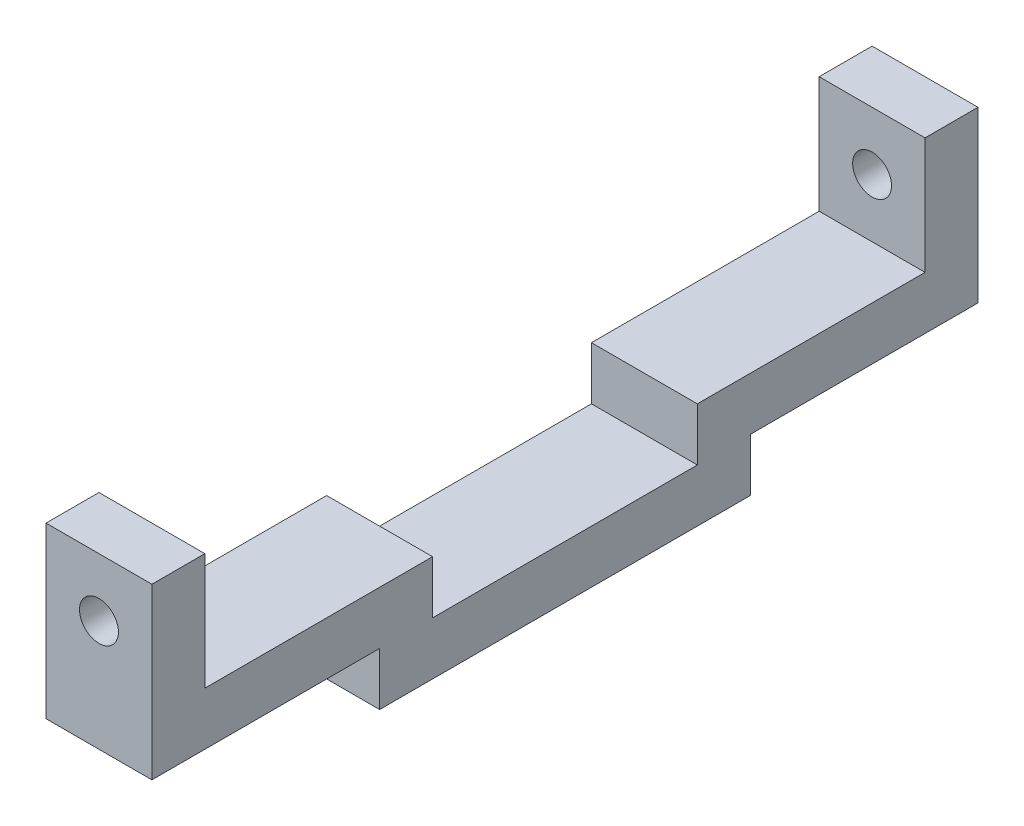
ISO-10303-21;
HEADER;
FILE_DESCRIPTION(('STEP AP214'),'2;1');
FILE_NAME('part.step','',(''),(''),'','','');
FILE_SCHEMA(('AUTOMOTIVE_DESIGN { 1 0 10303 214 1 1 1 1 }'));
ENDSEC;
DATA;
#1=APPLICATION_CONTEXT('core data for automotive mechanical design processes');
#2=APPLICATION_PROTOCOL_DEFINITION('international standard','automotive_design',2000,#1);
#3=PRODUCT_CONTEXT('',#1,'mechanical');
#4=PRODUCT('Part','Part','',(#3));
#5=PRODUCT_RELATED_PRODUCT_CATEGORY('part','',(#4));
#6=PRODUCT_DEFINITION_FORMATION('','',#4);
#7=PRODUCT_DEFINITION_CONTEXT('part definition',#1,'design');
#8=PRODUCT_DEFINITION('design','',#6,#7);
#9=PRODUCT_DEFINITION_SHAPE('','',#8);
#10=(LENGTH_UNIT() NAMED_UNIT(*) SI_UNIT(.MILLI.,.METRE.));
#11=(NAMED_UNIT(*) PLANE_ANGLE_UNIT() SI_UNIT($,.RADIAN.));
#12=(NAMED_UNIT(*) SI_UNIT($,.STERADIAN.) SOLID_ANGLE_UNIT());
#13=UNCERTAINTY_MEASURE_WITH_UNIT(LENGTH_MEASURE(1.E-05),#10,'distance_accuracy_value','');
#14=(GEOMETRIC_REPRESENTATION_CONTEXT(3) GLOBAL_UNCERTAINTY_ASSIGNED_CONTEXT((#13)) GLOBAL_UNIT_ASSIGNED_CONTEXT((#10,
#11,#12)) REPRESENTATION_CONTEXT('',''));
#15=CARTESIAN_POINT('',(0.,0.,0.));
#16=DIRECTION('',(0.,0.,1.));
#17=DIRECTION('',(1.,0.,0.));
#18=AXIS2_PLACEMENT_3D('',#15,#16,#17);
#19=CARTESIAN_POINT('',(10.,-10.5,0.));
#20=DIRECTION('',(0.,1.,0.));
#21=DIRECTION('',(0.,0.,1.));
#22=AXIS2_PLACEMENT_3D('',#19,#20,#21);
#23=PLANE('',#22);
#24=DIRECTION('',(1.,0.,0.));
#25=VECTOR('',#24,1.);
#26=CARTESIAN_POINT('',(0.,-10.5,-17.5));
#27=LINE('',#26,#25);
#28=CARTESIAN_POINT('',(0.,-10.5,-17.5));
#29=VERTEX_POINT('',#28);
#30=CARTESIAN_POINT('',(10.,-10.5,-17.5));
#31=VERTEX_POINT('',#30);
#32=EDGE_CURVE('E357',#29,#31,#27,.T.);
#33=ORIENTED_EDGE('',*,*,#32,.T.);
#34=DIRECTION('',(0.,0.,-1.));
#35=VECTOR('',#34,1.);
#36=CARTESIAN_POINT('',(10.,-10.5,0.));
#37=LINE('',#36,#35);
#38=CARTESIAN_POINT('',(10.,-10.5,17.5));
#39=VERTEX_POINT('',#38);
#40=EDGE_CURVE('E323',#39,#31,#37,.T.);
#41=ORIENTED_EDGE('',*,*,#40,.F.);
#42=DIRECTION('',(1.,0.,0.));
#43=VECTOR('',#42,1.);
#44=CARTESIAN_POINT('',(0.,-10.5,17.5));
#45=LINE('',#44,#43);
#46=CARTESIAN_POINT('',(0.,-10.5,17.5));
#47=VERTEX_POINT('',#46);
#48=EDGE_CURVE('E132',#47,#39,#45,.T.);
#49=ORIENTED_EDGE('',*,*,#48,.F.);
#50=DIRECTION('',(0.,0.,-1.));
#51=VECTOR('',#50,1.);
#52=CARTESIAN_POINT('',(0.,-10.5,0.));
#53=LINE('',#52,#51);
#54=EDGE_CURVE('E245',#47,#29,#53,.T.);
#55=ORIENTED_EDGE('',*,*,#54,.T.);
#56=EDGE_LOOP('',(#33,#41,#49,#55));
#57=FACE_BOUND('',#56,.T.);
#58=ADVANCED_FACE('F107',(#57),#23,.F.);
#59=CARTESIAN_POINT('',(10.,0.,-39.));
#60=DIRECTION('',(0.,0.,1.));
#61=DIRECTION('',(0.,-1.,0.));
#62=AXIS2_PLACEMENT_3D('',#59,#60,#61);
#63=PLANE('',#62);
#64=CARTESIAN_POINT('',(5.,5.,-39.));
#65=DIRECTION('',(0.,0.,1.));
#66=DIRECTION('',(1.,0.,0.));
#67=AXIS2_PLACEMENT_3D('',#64,#65,#66);
#68=CIRCLE('',#67,1.83658591452709);
#69=CARTESIAN_POINT('',(6.83658591452709,5.,-39.));
#70=VERTEX_POINT('',#69);
#71=EDGE_CURVE('E339',#70,#70,#68,.T.);
#72=ORIENTED_EDGE('',*,*,#71,.T.);
#73=EDGE_LOOP('',(#72));
#74=FACE_BOUND('',#73,.T.);
#75=DIRECTION('',(1.,0.,0.));
#76=VECTOR('',#75,1.);
#77=CARTESIAN_POINT('',(0.,-5.5,-39.));
#78=LINE('',#77,#76);
#79=CARTESIAN_POINT('',(0.,-5.5,-39.));
#80=VERTEX_POINT('',#79);
#81=CARTESIAN_POINT('',(10.,-5.5,-39.));
#82=VERTEX_POINT('',#81);
#83=EDGE_CURVE('E124',#80,#82,#78,.T.);
#84=ORIENTED_EDGE('',*,*,#83,.F.);
#85=DIRECTION('',(0.,1.,0.));
#86=VECTOR('',#85,1.);
#87=CARTESIAN_POINT('',(0.,0.,-39.));
#88=LINE('',#87,#86);
#89=CARTESIAN_POINT('',(0.,10.5,-39.));
#90=VERTEX_POINT('',#89);
#91=EDGE_CURVE('E235',#80,#90,#88,.T.);
#92=ORIENTED_EDGE('',*,*,#91,.T.);
#93=DIRECTION('',(-1.,0.,0.));
#94=VECTOR('',#93,1.);
#95=CARTESIAN_POINT('',(10.,10.5,-39.));
#96=LINE('',#95,#94);
#97=CARTESIAN_POINT('',(10.,10.5,-39.));
#98=VERTEX_POINT('',#97);
#99=EDGE_CURVE('E256',#98,#90,#96,.T.);
#100=ORIENTED_EDGE('',*,*,#99,.F.);
#101=DIRECTION('',(0.,1.,0.));
#102=VECTOR('',#101,1.);
#103=CARTESIAN_POINT('',(10.,0.,-39.));
#104=LINE('',#103,#102);
#105=EDGE_CURVE('E237',#82,#98,#104,.T.);
#106=ORIENTED_EDGE('',*,*,#105,.F.);
#107=EDGE_LOOP('',(#84,#92,#100,#106));
#108=FACE_BOUND('',#107,.T.);
#109=ADVANCED_FACE('F233',(#74,#108),#63,.F.);
#110=CARTESIAN_POINT('',(0.,0.,0.));
#111=DIRECTION('',(1.,0.,0.));
#112=DIRECTION('',(0.,0.,-1.));
#113=AXIS2_PLACEMENT_3D('',#110,#111,#112);
#114=PLANE('',#113);
#115=DIRECTION('',(0.,1.,0.));
#116=VECTOR('',#115,1.);
#117=CARTESIAN_POINT('',(0.,-10.5,-17.5));
#118=LINE('',#117,#116);
#119=CARTESIAN_POINT('',(0.,-5.5,-17.5));
#120=VERTEX_POINT('',#119);
#121=EDGE_CURVE('E228',#29,#120,#118,.T.);
#122=ORIENTED_EDGE('',*,*,#121,.F.);
#123=ORIENTED_EDGE('',*,*,#54,.F.);
#124=DIRECTION('',(0.,1.,0.));
#125=VECTOR('',#124,1.);
#126=CARTESIAN_POINT('',(0.,-10.5,17.5));
#127=LINE('',#126,#125);
#128=CARTESIAN_POINT('',(0.,-5.5,17.5));
#129=VERTEX_POINT('',#128);
#130=EDGE_CURVE('E354',#47,#129,#127,.T.);
#131=ORIENTED_EDGE('',*,*,#130,.T.);
#132=DIRECTION('',(0.,0.,1.));
#133=VECTOR('',#132,1.);
#134=CARTESIAN_POINT('',(0.,-5.5,39.));
#135=LINE('',#134,#133);
#136=CARTESIAN_POINT('',(0.,-5.5,39.));
#137=VERTEX_POINT('',#136);
#138=EDGE_CURVE('E348',#129,#137,#135,.T.);
#139=ORIENTED_EDGE('',*,*,#138,.T.);
#140=DIRECTION('',(0.,1.,0.));
#141=VECTOR('',#140,1.);
#142=CARTESIAN_POINT('',(0.,0.,39.));
#143=LINE('',#142,#141);
#144=CARTESIAN_POINT('',(0.,10.5,39.));
#145=VERTEX_POINT('',#144);
#146=EDGE_CURVE('E252',#137,#145,#143,.T.);
#147=ORIENTED_EDGE('',*,*,#146,.T.);
#148=DIRECTION('',(0.,0.,-1.));
#149=VECTOR('',#148,1.);
#150=CARTESIAN_POINT('',(0.,10.5,0.));
#151=LINE('',#150,#149);
#152=CARTESIAN_POINT('',(0.,10.5,34.));
#153=VERTEX_POINT('',#152);
#154=EDGE_CURVE('E312',#145,#153,#151,.T.);
#155=ORIENTED_EDGE('',*,*,#154,.T.);
#156=DIRECTION('',(0.,-1.,0.));
#157=VECTOR('',#156,1.);
#158=CARTESIAN_POINT('',(0.,0.,34.));
#159=LINE('',#158,#157);
#160=CARTESIAN_POINT('',(0.,-0.500000000000004,34.));
#161=VERTEX_POINT('',#160);
#162=EDGE_CURVE('E308',#153,#161,#159,.T.);
#163=ORIENTED_EDGE('',*,*,#162,.T.);
#164=DIRECTION('',(0.,0.,-1.));
#165=VECTOR('',#164,1.);
#166=CARTESIAN_POINT('',(0.,-0.500000000000004,34.));
#167=LINE('',#166,#165);
#168=CARTESIAN_POINT('',(0.,-0.5,12.5));
#169=VERTEX_POINT('',#168);
#170=EDGE_CURVE('E275',#161,#169,#167,.T.);
#171=ORIENTED_EDGE('',*,*,#170,.T.);
#172=DIRECTION('',(0.,1.,0.));
#173=VECTOR('',#172,1.);
#174=CARTESIAN_POINT('',(0.,-5.5,12.5));
#175=LINE('',#174,#173);
#176=CARTESIAN_POINT('',(0.,-5.5,12.5));
#177=VERTEX_POINT('',#176);
#178=EDGE_CURVE('E272',#177,#169,#175,.T.);
#179=ORIENTED_EDGE('',*,*,#178,.F.);
#180=DIRECTION('',(0.,0.,-1.));
#181=VECTOR('',#180,1.);
#182=CARTESIAN_POINT('',(0.,-5.5,0.));
#183=LINE('',#182,#181);
#184=CARTESIAN_POINT('',(0.,-5.5,-12.5));
#185=VERTEX_POINT('',#184);
#186=EDGE_CURVE('E299',#177,#185,#183,.T.);
#187=ORIENTED_EDGE('',*,*,#186,.T.);
#188=DIRECTION('',(0.,1.,0.));
#189=VECTOR('',#188,1.);
#190=CARTESIAN_POINT('',(0.,-5.5,-12.5));
#191=LINE('',#190,#189);
#192=CARTESIAN_POINT('',(0.,-0.500000000000001,-12.5));
#193=VERTEX_POINT('',#192);
#194=EDGE_CURVE('E285',#185,#193,#191,.T.);
#195=ORIENTED_EDGE('',*,*,#194,.T.);
#196=DIRECTION('',(0.,0.,1.));
#197=VECTOR('',#196,1.);
#198=CARTESIAN_POINT('',(0.,-0.500000000000001,-34.));
#199=LINE('',#198,#197);
#200=CARTESIAN_POINT('',(0.,-0.500000000000001,-34.));
#201=VERTEX_POINT('',#200);
#202=EDGE_CURVE('E288',#201,#193,#199,.T.);
#203=ORIENTED_EDGE('',*,*,#202,.F.);
#204=DIRECTION('',(0.,-1.,0.));
#205=VECTOR('',#204,1.);
#206=CARTESIAN_POINT('',(0.,0.,-34.));
#207=LINE('',#206,#205);
#208=CARTESIAN_POINT('',(0.,10.5,-34.));
#209=VERTEX_POINT('',#208);
#210=EDGE_CURVE('E309',#209,#201,#207,.T.);
#211=ORIENTED_EDGE('',*,*,#210,.F.);
#212=EDGE_CURVE('E243',#209,#90,#151,.T.);
#213=ORIENTED_EDGE('',*,*,#212,.T.);
#214=ORIENTED_EDGE('',*,*,#91,.F.);
#215=DIRECTION('',(0.,0.,-1.));
#216=VECTOR('',#215,1.);
#217=CARTESIAN_POINT('',(0.,-5.5,-39.));
#218=LINE('',#217,#216);
#219=EDGE_CURVE('E222',#120,#80,#218,.T.);
#220=ORIENTED_EDGE('',*,*,#219,.F.);
#221=EDGE_LOOP('',(#122,#123,#131,#139,#147,#155,#163,#171,#179,#187,#195,#203,#211,#213,#214,#220));
#222=FACE_BOUND('',#221,.T.);
#223=ADVANCED_FACE('F240',(#222),#114,.F.);
#224=CARTESIAN_POINT('',(10.,0.,0.));
#225=DIRECTION('',(1.,0.,0.));
#226=DIRECTION('',(0.,0.,-1.));
#227=AXIS2_PLACEMENT_3D('',#224,#225,#226);
#228=PLANE('',#227);
#229=ORIENTED_EDGE('',*,*,#40,.T.);
#230=DIRECTION('',(0.,1.,0.));
#231=VECTOR('',#230,1.);
#232=CARTESIAN_POINT('',(10.,-10.5,-17.5));
#233=LINE('',#232,#231);
#234=CARTESIAN_POINT('',(10.,-5.5,-17.5));
#235=VERTEX_POINT('',#234);
#236=EDGE_CURVE('E229',#31,#235,#233,.T.);
#237=ORIENTED_EDGE('',*,*,#236,.T.);
#238=DIRECTION('',(0.,0.,-1.));
#239=VECTOR('',#238,1.);
#240=CARTESIAN_POINT('',(10.,-5.5,-39.));
#241=LINE('',#240,#239);
#242=EDGE_CURVE('E366',#235,#82,#241,.T.);
#243=ORIENTED_EDGE('',*,*,#242,.T.);
#244=ORIENTED_EDGE('',*,*,#105,.T.);
#245=DIRECTION('',(0.,0.,-1.));
#246=VECTOR('',#245,1.);
#247=CARTESIAN_POINT('',(10.,10.5,0.));
#248=LINE('',#247,#246);
#249=CARTESIAN_POINT('',(10.,10.5,-34.));
#250=VERTEX_POINT('',#249);
#251=EDGE_CURVE('E244',#250,#98,#248,.T.);
#252=ORIENTED_EDGE('',*,*,#251,.F.);
#253=DIRECTION('',(0.,-1.,0.));
#254=VECTOR('',#253,1.);
#255=CARTESIAN_POINT('',(10.,0.,-34.));
#256=LINE('',#255,#254);
#257=CARTESIAN_POINT('',(10.,-0.500000000000001,-34.));
#258=VERTEX_POINT('',#257);
#259=EDGE_CURVE('E248',#250,#258,#256,.T.);
#260=ORIENTED_EDGE('',*,*,#259,.T.);
#261=DIRECTION('',(0.,0.,1.));
#262=VECTOR('',#261,1.);
#263=CARTESIAN_POINT('',(10.,-0.500000000000001,-34.));
#264=LINE('',#263,#262);
#265=CARTESIAN_POINT('',(10.,-0.500000000000001,-12.5));
#266=VERTEX_POINT('',#265);
#267=EDGE_CURVE('E282',#258,#266,#264,.T.);
#268=ORIENTED_EDGE('',*,*,#267,.T.);
#269=DIRECTION('',(0.,1.,0.));
#270=VECTOR('',#269,1.);
#271=CARTESIAN_POINT('',(10.,-5.5,-12.5));
#272=LINE('',#271,#270);
#273=CARTESIAN_POINT('',(10.,-5.5,-12.5));
#274=VERTEX_POINT('',#273);
#275=EDGE_CURVE('E284',#274,#266,#272,.T.);
#276=ORIENTED_EDGE('',*,*,#275,.F.);
#277=DIRECTION('',(0.,0.,-1.));
#278=VECTOR('',#277,1.);
#279=CARTESIAN_POINT('',(10.,-5.5,0.));
#280=LINE('',#279,#278);
#281=CARTESIAN_POINT('',(10.,-5.5,12.5));
#282=VERTEX_POINT('',#281);
#283=EDGE_CURVE('E301',#282,#274,#280,.T.);
#284=ORIENTED_EDGE('',*,*,#283,.F.);
#285=DIRECTION('',(0.,1.,0.));
#286=VECTOR('',#285,1.);
#287=CARTESIAN_POINT('',(10.,-5.5,12.5));
#288=LINE('',#287,#286);
#289=CARTESIAN_POINT('',(10.,-0.5,12.5));
#290=VERTEX_POINT('',#289);
#291=EDGE_CURVE('E271',#282,#290,#288,.T.);
#292=ORIENTED_EDGE('',*,*,#291,.T.);
#293=DIRECTION('',(0.,0.,-1.));
#294=VECTOR('',#293,1.);
#295=CARTESIAN_POINT('',(10.,-0.500000000000004,34.));
#296=LINE('',#295,#294);
#297=CARTESIAN_POINT('',(10.,-0.500000000000004,34.));
#298=VERTEX_POINT('',#297);
#299=EDGE_CURVE('E268',#298,#290,#296,.T.);
#300=ORIENTED_EDGE('',*,*,#299,.F.);
#301=DIRECTION('',(0.,-1.,0.));
#302=VECTOR('',#301,1.);
#303=CARTESIAN_POINT('',(10.,0.,34.));
#304=LINE('',#303,#302);
#305=CARTESIAN_POINT('',(10.,10.5,34.));
#306=VERTEX_POINT('',#305);
#307=EDGE_CURVE('E328',#306,#298,#304,.T.);
#308=ORIENTED_EDGE('',*,*,#307,.F.);
#309=CARTESIAN_POINT('',(10.,10.5,39.));
#310=VERTEX_POINT('',#309);
#311=EDGE_CURVE('E250',#310,#306,#248,.T.);
#312=ORIENTED_EDGE('',*,*,#311,.F.);
#313=DIRECTION('',(0.,1.,0.));
#314=VECTOR('',#313,1.);
#315=CARTESIAN_POINT('',(10.,0.,39.));
#316=LINE('',#315,#314);
#317=CARTESIAN_POINT('',(10.,-5.5,39.));
#318=VERTEX_POINT('',#317);
#319=EDGE_CURVE('E326',#318,#310,#316,.T.);
#320=ORIENTED_EDGE('',*,*,#319,.F.);
#321=DIRECTION('',(0.,0.,1.));
#322=VECTOR('',#321,1.);
#323=CARTESIAN_POINT('',(10.,-5.5,39.));
#324=LINE('',#323,#322);
#325=CARTESIAN_POINT('',(10.,-5.5,17.5));
#326=VERTEX_POINT('',#325);
#327=EDGE_CURVE('E352',#326,#318,#324,.T.);
#328=ORIENTED_EDGE('',*,*,#327,.F.);
#329=DIRECTION('',(0.,1.,0.));
#330=VECTOR('',#329,1.);
#331=CARTESIAN_POINT('',(10.,-10.5,17.5));
#332=LINE('',#331,#330);
#333=EDGE_CURVE('E355',#39,#326,#332,.T.);
#334=ORIENTED_EDGE('',*,*,#333,.F.);
#335=EDGE_LOOP('',(#229,#237,#243,#244,#252,#260,#268,#276,#284,#292,#300,#308,#312,#320,#328,#334));
#336=FACE_BOUND('',#335,.T.);
#337=ADVANCED_FACE('F374',(#336),#228,.T.);
#338=CARTESIAN_POINT('',(10.,0.,-34.));
#339=DIRECTION('',(0.,0.,-1.));
#340=DIRECTION('',(-1.,0.,0.));
#341=AXIS2_PLACEMENT_3D('',#338,#339,#340);
#342=PLANE('',#341);
#343=CARTESIAN_POINT('',(5.,5.,-34.));
#344=DIRECTION('',(0.,0.,-1.));
#345=DIRECTION('',(-1.,0.,0.));
#346=AXIS2_PLACEMENT_3D('',#343,#344,#345);
#347=CIRCLE('',#346,1.83658591452709);
#348=CARTESIAN_POINT('',(3.16341408547291,5.,-34.));
#349=VERTEX_POINT('',#348);
#350=EDGE_CURVE('E291',#349,#349,#347,.T.);
#351=ORIENTED_EDGE('',*,*,#350,.T.);
#352=EDGE_LOOP('',(#351));
#353=FACE_BOUND('',#352,.T.);
#354=DIRECTION('',(-1.,0.,0.));
#355=VECTOR('',#354,1.);
#356=CARTESIAN_POINT('',(10.,-0.500000000000001,-34.));
#357=LINE('',#356,#355);
#358=EDGE_CURVE('E12',#258,#201,#357,.T.);
#359=ORIENTED_EDGE('',*,*,#358,.F.);
#360=ORIENTED_EDGE('',*,*,#259,.F.);
#361=DIRECTION('',(-1.,0.,0.));
#362=VECTOR('',#361,1.);
#363=CARTESIAN_POINT('',(10.,10.5,-34.));
#364=LINE('',#363,#362);
#365=EDGE_CURVE('E263',#250,#209,#364,.T.);
#366=ORIENTED_EDGE('',*,*,#365,.T.);
#367=ORIENTED_EDGE('',*,*,#210,.T.);
#368=EDGE_LOOP('',(#359,#360,#366,#367));
#369=FACE_BOUND('',#368,.T.);
#370=ADVANCED_FACE('F406',(#353,#369),#342,.F.);
#371=CARTESIAN_POINT('',(10.,-5.5,0.));
#372=DIRECTION('',(0.,1.,0.));
#373=DIRECTION('',(0.,0.,1.));
#374=AXIS2_PLACEMENT_3D('',#371,#372,#373);
#375=PLANE('',#374);
#376=ORIENTED_EDGE('',*,*,#186,.F.);
#377=DIRECTION('',(1.,0.,0.));
#378=VECTOR('',#377,1.);
#379=CARTESIAN_POINT('',(10.,-5.5,12.5));
#380=LINE('',#379,#378);
#381=EDGE_CURVE('E116',#177,#282,#380,.T.);
#382=ORIENTED_EDGE('',*,*,#381,.T.);
#383=ORIENTED_EDGE('',*,*,#283,.T.);
#384=DIRECTION('',(-1.,0.,0.));
#385=VECTOR('',#384,1.);
#386=CARTESIAN_POINT('',(10.,-5.5,-12.5));
#387=LINE('',#386,#385);
#388=EDGE_CURVE('E267',#274,#185,#387,.T.);
#389=ORIENTED_EDGE('',*,*,#388,.T.);
#390=EDGE_LOOP('',(#376,#382,#383,#389));
#391=FACE_BOUND('',#390,.T.);
#392=ADVANCED_FACE('F297',(#391),#375,.T.);
#393=CARTESIAN_POINT('',(10.,0.,34.));
#394=DIRECTION('',(0.,0.,-1.));
#395=DIRECTION('',(-1.,0.,0.));
#396=AXIS2_PLACEMENT_3D('',#393,#394,#395);
#397=PLANE('',#396);
#398=CARTESIAN_POINT('',(5.,5.,34.));
#399=DIRECTION('',(0.,0.,-1.));
#400=DIRECTION('',(-1.,0.,0.));
#401=AXIS2_PLACEMENT_3D('',#398,#399,#400);
#402=CIRCLE('',#401,1.83658591452709);
#403=CARTESIAN_POINT('',(3.16341408547291,5.,34.));
#404=VERTEX_POINT('',#403);
#405=EDGE_CURVE('E336',#404,#404,#402,.T.);
#406=ORIENTED_EDGE('',*,*,#405,.F.);
#407=EDGE_LOOP('',(#406));
#408=FACE_BOUND('',#407,.T.);
#409=ORIENTED_EDGE('',*,*,#307,.T.);
#410=DIRECTION('',(-1.,0.,0.));
#411=VECTOR('',#410,1.);
#412=CARTESIAN_POINT('',(10.,-0.500000000000004,34.));
#413=LINE('',#412,#411);
#414=EDGE_CURVE('E265',#298,#161,#413,.T.);
#415=ORIENTED_EDGE('',*,*,#414,.T.);
#416=ORIENTED_EDGE('',*,*,#162,.F.);
#417=DIRECTION('',(-1.,0.,0.));
#418=VECTOR('',#417,1.);
#419=CARTESIAN_POINT('',(10.,10.5,34.));
#420=LINE('',#419,#418);
#421=EDGE_CURVE('E261',#306,#153,#420,.T.);
#422=ORIENTED_EDGE('',*,*,#421,.F.);
#423=EDGE_LOOP('',(#409,#415,#416,#422));
#424=FACE_BOUND('',#423,.T.);
#425=ADVANCED_FACE('F392',(#408,#424),#397,.T.);
#426=CARTESIAN_POINT('',(10.,10.5,0.));
#427=DIRECTION('',(0.,1.,0.));
#428=DIRECTION('',(0.,0.,1.));
#429=AXIS2_PLACEMENT_3D('',#426,#427,#428);
#430=PLANE('',#429);
#431=ORIENTED_EDGE('',*,*,#154,.F.);
#432=DIRECTION('',(-1.,0.,0.));
#433=VECTOR('',#432,1.);
#434=CARTESIAN_POINT('',(10.,10.5,39.));
#435=LINE('',#434,#433);
#436=EDGE_CURVE('E258',#310,#145,#435,.T.);
#437=ORIENTED_EDGE('',*,*,#436,.F.);
#438=ORIENTED_EDGE('',*,*,#311,.T.);
#439=ORIENTED_EDGE('',*,*,#421,.T.);
#440=EDGE_LOOP('',(#431,#437,#438,#439));
#441=FACE_BOUND('',#440,.T.);
#442=ADVANCED_FACE('F388',(#441),#430,.T.);
#443=CARTESIAN_POINT('',(10.,0.,39.));
#444=DIRECTION('',(0.,0.,1.));
#445=DIRECTION('',(0.,-1.,0.));
#446=AXIS2_PLACEMENT_3D('',#443,#444,#445);
#447=PLANE('',#446);
#448=DIRECTION('',(1.,0.,0.));
#449=VECTOR('',#448,1.);
#450=CARTESIAN_POINT('',(0.,-5.5,39.));
#451=LINE('',#450,#449);
#452=EDGE_CURVE('E345',#137,#318,#451,.T.);
#453=ORIENTED_EDGE('',*,*,#452,.T.);
#454=ORIENTED_EDGE('',*,*,#319,.T.);
#455=ORIENTED_EDGE('',*,*,#436,.T.);
#456=ORIENTED_EDGE('',*,*,#146,.F.);
#457=EDGE_LOOP('',(#453,#454,#455,#456));
#458=FACE_BOUND('',#457,.T.);
#459=CARTESIAN_POINT('',(5.,5.,39.));
#460=DIRECTION('',(0.,0.,1.));
#461=DIRECTION('',(1.,0.,0.));
#462=AXIS2_PLACEMENT_3D('',#459,#460,#461);
#463=CIRCLE('',#462,1.83658591452709);
#464=CARTESIAN_POINT('',(6.83658591452709,5.,39.));
#465=VERTEX_POINT('',#464);
#466=EDGE_CURVE('E342',#465,#465,#463,.T.);
#467=ORIENTED_EDGE('',*,*,#466,.F.);
#468=EDGE_LOOP('',(#467));
#469=FACE_BOUND('',#468,.T.);
#470=ADVANCED_FACE('F382',(#458,#469),#447,.T.);
#471=ORIENTED_EDGE('',*,*,#212,.F.);
#472=ORIENTED_EDGE('',*,*,#365,.F.);
#473=ORIENTED_EDGE('',*,*,#251,.T.);
#474=ORIENTED_EDGE('',*,*,#99,.T.);
#475=EDGE_LOOP('',(#471,#472,#473,#474));
#476=FACE_BOUND('',#475,.T.);
#477=ADVANCED_FACE('F408',(#476),#430,.T.);
#478=CARTESIAN_POINT('',(10.,-5.5,-12.5));
#479=DIRECTION('',(0.,0.,1.));
#480=DIRECTION('',(1.,0.,0.));
#481=AXIS2_PLACEMENT_3D('',#478,#479,#480);
#482=PLANE('',#481);
#483=ORIENTED_EDGE('',*,*,#194,.F.);
#484=ORIENTED_EDGE('',*,*,#388,.F.);
#485=ORIENTED_EDGE('',*,*,#275,.T.);
#486=DIRECTION('',(-1.,0.,0.));
#487=VECTOR('',#486,1.);
#488=CARTESIAN_POINT('',(10.,-0.500000000000001,-12.5));
#489=LINE('',#488,#487);
#490=EDGE_CURVE('E111',#266,#193,#489,.T.);
#491=ORIENTED_EDGE('',*,*,#490,.T.);
#492=EDGE_LOOP('',(#483,#484,#485,#491));
#493=FACE_BOUND('',#492,.T.);
#494=ADVANCED_FACE('F304',(#493),#482,.T.);
#495=CARTESIAN_POINT('',(10.,-0.500000000000001,-34.));
#496=DIRECTION('',(0.,-1.,0.));
#497=DIRECTION('',(0.,0.,-1.));
#498=AXIS2_PLACEMENT_3D('',#495,#496,#497);
#499=PLANE('',#498);
#500=ORIENTED_EDGE('',*,*,#202,.T.);
#501=ORIENTED_EDGE('',*,*,#490,.F.);
#502=ORIENTED_EDGE('',*,*,#267,.F.);
#503=ORIENTED_EDGE('',*,*,#358,.T.);
#504=EDGE_LOOP('',(#500,#501,#502,#503));
#505=FACE_BOUND('',#504,.T.);
#506=ADVANCED_FACE('F109',(#505),#499,.F.);
#507=CARTESIAN_POINT('',(10.,-5.5,12.5));
#508=DIRECTION('',(0.,0.,1.));
#509=DIRECTION('',(1.,0.,0.));
#510=AXIS2_PLACEMENT_3D('',#507,#508,#509);
#511=PLANE('',#510);
#512=ORIENTED_EDGE('',*,*,#178,.T.);
#513=DIRECTION('',(-1.,0.,0.));
#514=VECTOR('',#513,1.);
#515=CARTESIAN_POINT('',(10.,-0.5,12.5));
#516=LINE('',#515,#514);
#517=EDGE_CURVE('E274',#290,#169,#516,.T.);
#518=ORIENTED_EDGE('',*,*,#517,.F.);
#519=ORIENTED_EDGE('',*,*,#291,.F.);
#520=ORIENTED_EDGE('',*,*,#381,.F.);
#521=EDGE_LOOP('',(#512,#518,#519,#520));
#522=FACE_BOUND('',#521,.T.);
#523=ADVANCED_FACE('F400',(#522),#511,.F.);
#524=CARTESIAN_POINT('',(10.,-0.500000000000004,34.));
#525=DIRECTION('',(0.,1.,0.));
#526=DIRECTION('',(0.,0.,1.));
#527=AXIS2_PLACEMENT_3D('',#524,#525,#526);
#528=PLANE('',#527);
#529=ORIENTED_EDGE('',*,*,#170,.F.);
#530=ORIENTED_EDGE('',*,*,#414,.F.);
#531=ORIENTED_EDGE('',*,*,#299,.T.);
#532=ORIENTED_EDGE('',*,*,#517,.T.);
#533=EDGE_LOOP('',(#529,#530,#531,#532));
#534=FACE_BOUND('',#533,.T.);
#535=ADVANCED_FACE('F395',(#534),#528,.T.);
#536=CARTESIAN_POINT('',(5.,5.,-39.));
#537=DIRECTION('',(0.,0.,1.));
#538=DIRECTION('',(1.,0.,0.));
#539=AXIS2_PLACEMENT_3D('',#536,#537,#538);
#540=CYLINDRICAL_SURFACE('',#539,1.83658591452709);
#541=ORIENTED_EDGE('',*,*,#71,.F.);
#542=EDGE_LOOP('',(#541));
#543=FACE_BOUND('',#542,.T.);
#544=ORIENTED_EDGE('',*,*,#350,.F.);
#545=EDGE_LOOP('',(#544));
#546=FACE_BOUND('',#545,.T.);
#547=ADVANCED_FACE('F433',(#543,#546),#540,.F.);
#548=ORIENTED_EDGE('',*,*,#405,.T.);
#549=EDGE_LOOP('',(#548));
#550=FACE_BOUND('',#549,.T.);
#551=ORIENTED_EDGE('',*,*,#466,.T.);
#552=EDGE_LOOP('',(#551));
#553=FACE_BOUND('',#552,.T.);
#554=ADVANCED_FACE('F430',(#550,#553),#540,.F.);
#555=CARTESIAN_POINT('',(0.,-5.5,39.));
#556=DIRECTION('',(0.,1.,0.));
#557=DIRECTION('',(0.,0.,1.));
#558=AXIS2_PLACEMENT_3D('',#555,#556,#557);
#559=PLANE('',#558);
#560=ORIENTED_EDGE('',*,*,#327,.T.);
#561=ORIENTED_EDGE('',*,*,#452,.F.);
#562=ORIENTED_EDGE('',*,*,#138,.F.);
#563=DIRECTION('',(1.,0.,0.));
#564=VECTOR('',#563,1.);
#565=CARTESIAN_POINT('',(0.,-5.5,17.5));
#566=LINE('',#565,#564);
#567=EDGE_CURVE('E347',#129,#326,#566,.T.);
#568=ORIENTED_EDGE('',*,*,#567,.T.);
#569=EDGE_LOOP('',(#560,#561,#562,#568));
#570=FACE_BOUND('',#569,.T.);
#571=ADVANCED_FACE('F380',(#570),#559,.F.);
#572=CARTESIAN_POINT('',(0.,-10.5,17.5));
#573=DIRECTION('',(0.,0.,-1.));
#574=DIRECTION('',(-1.,0.,0.));
#575=AXIS2_PLACEMENT_3D('',#572,#573,#574);
#576=PLANE('',#575);
#577=ORIENTED_EDGE('',*,*,#333,.T.);
#578=ORIENTED_EDGE('',*,*,#567,.F.);
#579=ORIENTED_EDGE('',*,*,#130,.F.);
#580=ORIENTED_EDGE('',*,*,#48,.T.);
#581=EDGE_LOOP('',(#577,#578,#579,#580));
#582=FACE_BOUND('',#581,.T.);
#583=ADVANCED_FACE('F377',(#582),#576,.F.);
#584=CARTESIAN_POINT('',(0.,-10.5,-17.5));
#585=DIRECTION('',(0.,0.,-1.));
#586=DIRECTION('',(-1.,0.,0.));
#587=AXIS2_PLACEMENT_3D('',#584,#585,#586);
#588=PLANE('',#587);
#589=ORIENTED_EDGE('',*,*,#236,.F.);
#590=ORIENTED_EDGE('',*,*,#32,.F.);
#591=ORIENTED_EDGE('',*,*,#121,.T.);
#592=DIRECTION('',(1.,0.,0.));
#593=VECTOR('',#592,1.);
#594=CARTESIAN_POINT('',(0.,-5.5,-17.5));
#595=LINE('',#594,#593);
#596=EDGE_CURVE('E224',#120,#235,#595,.T.);
#597=ORIENTED_EDGE('',*,*,#596,.T.);
#598=EDGE_LOOP('',(#589,#590,#591,#597));
#599=FACE_BOUND('',#598,.T.);
#600=ADVANCED_FACE('F369',(#599),#588,.T.);
#601=CARTESIAN_POINT('',(0.,-5.5,-39.));
#602=DIRECTION('',(0.,-1.,0.));
#603=DIRECTION('',(0.,0.,-1.));
#604=AXIS2_PLACEMENT_3D('',#601,#602,#603);
#605=PLANE('',#604);
#606=ORIENTED_EDGE('',*,*,#242,.F.);
#607=ORIENTED_EDGE('',*,*,#596,.F.);
#608=ORIENTED_EDGE('',*,*,#219,.T.);
#609=ORIENTED_EDGE('',*,*,#83,.T.);
#610=EDGE_LOOP('',(#606,#607,#608,#609));
#611=FACE_BOUND('',#610,.T.);
#612=ADVANCED_FACE('F223',(#611),#605,.T.);
#613=CLOSED_SHELL('',(#58,#109,#223,#337,#370,#392,#425,#442,#470,#477,#494,#506,#523,#535,#547,
#554,#571,#583,#600,#612));
#614=MANIFOLD_SOLID_BREP('B2',#613);
#615=ADVANCED_BREP_SHAPE_REPRESENTATION('',(#18,#614),#14);
#616=SHAPE_DEFINITION_REPRESENTATION(#9,#615);
ENDSEC;
END-ISO-10303-21;
